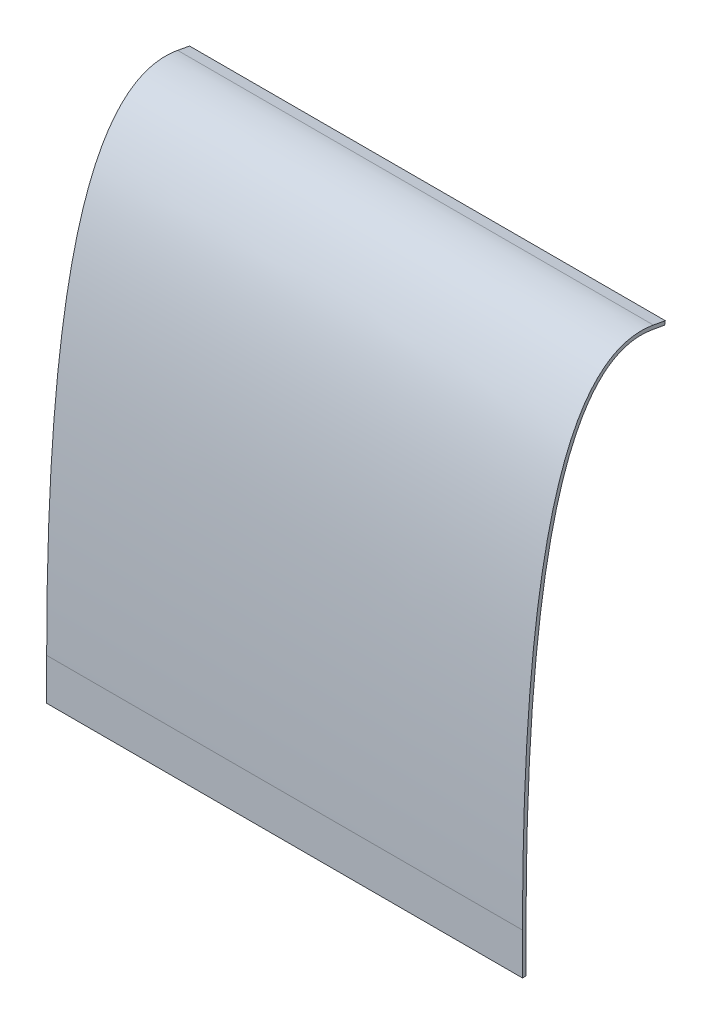
ISO-10303-21;
HEADER;
FILE_DESCRIPTION(('STEP AP214'),'2;1');
FILE_NAME('part.step','',(''),(''),'','','');
FILE_SCHEMA(('AUTOMOTIVE_DESIGN { 1 0 10303 214 1 1 1 1 }'));
ENDSEC;
DATA;
#1=APPLICATION_CONTEXT('core data for automotive mechanical design processes');
#2=APPLICATION_PROTOCOL_DEFINITION('international standard','automotive_design',2000,#1);
#3=PRODUCT_CONTEXT('',#1,'mechanical');
#4=PRODUCT('Part','Part','',(#3));
#5=PRODUCT_RELATED_PRODUCT_CATEGORY('part','',(#4));
#6=PRODUCT_DEFINITION_FORMATION('','',#4);
#7=PRODUCT_DEFINITION_CONTEXT('part definition',#1,'design');
#8=PRODUCT_DEFINITION('design','',#6,#7);
#9=PRODUCT_DEFINITION_SHAPE('','',#8);
#10=(LENGTH_UNIT() NAMED_UNIT(*) SI_UNIT(.MILLI.,.METRE.));
#11=(NAMED_UNIT(*) PLANE_ANGLE_UNIT() SI_UNIT($,.RADIAN.));
#12=(NAMED_UNIT(*) SI_UNIT($,.STERADIAN.) SOLID_ANGLE_UNIT());
#13=UNCERTAINTY_MEASURE_WITH_UNIT(LENGTH_MEASURE(1.E-05),#10,'distance_accuracy_value','');
#14=(GEOMETRIC_REPRESENTATION_CONTEXT(3) GLOBAL_UNCERTAINTY_ASSIGNED_CONTEXT((#13)) GLOBAL_UNIT_ASSIGNED_CONTEXT((#10,
#11,#12)) REPRESENTATION_CONTEXT('',''));
#15=CARTESIAN_POINT('',(0.,0.,0.));
#16=DIRECTION('',(0.,0.,1.));
#17=DIRECTION('',(1.,0.,0.));
#18=AXIS2_PLACEMENT_3D('',#15,#16,#17);
#19=CARTESIAN_POINT('',(0.,-5389.85380798461,3.175));
#20=DIRECTION('',(1.,0.,0.));
#21=DIRECTION('',(0.,0.,-1.));
#22=AXIS2_PLACEMENT_3D('',#19,#20,#21);
#23=PLANE('',#22);
#24=DIRECTION('',(0.,-1.,0.));
#25=VECTOR('',#24,1.);
#26=CARTESIAN_POINT('',(0.,-5389.85380798461,0.));
#27=LINE('',#26,#25);
#28=CARTESIAN_POINT('',(0.,-5353.3688870865,0.));
#29=VERTEX_POINT('',#28);
#30=CARTESIAN_POINT('',(0.,-5389.85380798461,0.));
#31=VERTEX_POINT('',#30);
#32=EDGE_CURVE('E95',#29,#31,#27,.T.);
#33=ORIENTED_EDGE('',*,*,#32,.T.);
#34=DIRECTION('',(0.,0.,-1.));
#35=VECTOR('',#34,1.);
#36=CARTESIAN_POINT('',(0.,-5389.85380798461,3.175));
#37=LINE('',#36,#35);
#38=CARTESIAN_POINT('',(0.,-5389.85380798461,3.175));
#39=VERTEX_POINT('',#38);
#40=EDGE_CURVE('E11',#39,#31,#37,.T.);
#41=ORIENTED_EDGE('',*,*,#40,.F.);
#42=DIRECTION('',(0.,-1.,0.));
#43=VECTOR('',#42,1.);
#44=CARTESIAN_POINT('',(0.,-5389.85380798461,3.175));
#45=LINE('',#44,#43);
#46=CARTESIAN_POINT('',(0.,-5353.3688870865,3.175));
#47=VERTEX_POINT('',#46);
#48=EDGE_CURVE('E88',#47,#39,#45,.T.);
#49=ORIENTED_EDGE('',*,*,#48,.F.);
#50=CARTESIAN_POINT('',(0.,-5353.36888708653,3.17500000000778));
#51=CARTESIAN_POINT('',(0.,-5351.18739690908,3.17500000000778));
#52=CARTESIAN_POINT('',(0.,-5346.81143134342,3.17046541119345));
#53=CARTESIAN_POINT('',(0.,-5338.16341017679,3.14325696182242));
#54=CARTESIAN_POINT('',(0.,-5327.47644189035,3.07523348434954));
#55=CARTESIAN_POINT('',(0.,-5314.87146346383,2.93917848605212));
#56=CARTESIAN_POINT('',(0.,-5298.34930967854,2.68519354129867));
#57=CARTESIAN_POINT('',(0.,-5278.23364403991,2.23160969948364));
#58=CARTESIAN_POINT('',(0.,-5254.95270820311,1.46947489333195));
#59=CARTESIAN_POINT('',(0.,-5232.52968924308,0.489420194706527));
#60=CARTESIAN_POINT('',(0.,-5203.7757149345,-1.10802295378445));
#61=CARTESIAN_POINT('',(0.,-5169.97633138787,-3.65020946172273));
#62=CARTESIAN_POINT('',(0.,-5132.84268915828,-7.57487259670182));
#63=CARTESIAN_POINT('',(0.,-5099.13022129233,-12.375948375276));
#64=CARTESIAN_POINT('',(0.,-5068.83293071087,-18.056948381596));
#65=CARTESIAN_POINT('',(0.,-5032.97936704028,-26.8143362972724));
#66=CARTESIAN_POINT('',(0.,-5003.91866903713,-37.3605308212154));
#67=CARTESIAN_POINT('',(0.,-4981.59890734606,-49.7957669766794));
#68=CARTESIAN_POINT('',(0.,-4968.22739997437,-60.1213480910538));
#69=CARTESIAN_POINT('',(0.,-4958.25876967498,-71.5130112879676));
#70=CARTESIAN_POINT('',(0.,-4952.88090222438,-81.9236706532397));
#71=CARTESIAN_POINT('',(0.,-4950.40661848939,-90.7533778061212));
#72=CARTESIAN_POINT('',(0.,-4949.47166616038,-97.5979563520359));
#73=CARTESIAN_POINT('',(0.,-4949.45950651735,-103.47459510175));
#74=CARTESIAN_POINT('',(0.,-4949.90159840565,-108.253920150395));
#75=CARTESIAN_POINT('',(0.,-4950.27722005877,-110.696774930827));
#76=CARTESIAN_POINT('',(0.,-4950.49814138065,-111.902729484396));
#77=B_SPLINE_CURVE_WITH_KNOTS('',3,(#50,#51,#52,#53,#54,#55,#56,#57,#58,#59,#60,#61,#62,#63,#64,
#65,#66,#67,#68,#69,#70,#71,#72,#73,#74,#75,#76),.UNSPECIFIED.,.F.,.F.,(4,1,1,1,1,1,1,1,1,1,1,1,
1,1,1,1,1,1,1,1,1,1,1,1,4),(0.490445446996945,0.490528714033794,0.490611981070642,
0.49077851514434,0.490945049218037,0.491111583291735,0.49144465143913,0.491777719586525,
0.49211078773392,0.492443855881316,0.493109992176106,0.493776128470896,0.494442264765686,
0.495108401060477,0.495774537355267,0.497106809944847,0.497772946239638,0.498439082534428,
0.499105218829218,0.499771355124008,0.500104423271403,0.500437491418799,0.500770559566194,
0.500937093639891,0.501103627713589),.UNSPECIFIED.);
#78=CARTESIAN_POINT('',(0.,-4950.49814138065,-111.902729484396));
#79=VERTEX_POINT('',#78);
#80=EDGE_CURVE('E49',#47,#79,#77,.T.);
#81=ORIENTED_EDGE('',*,*,#80,.T.);
#82=DIRECTION('',(0.,-0.180193443157536,-0.983631192593561));
#83=VECTOR('',#82,1.);
#84=CARTESIAN_POINT('',(0.,-4950.49814138065,-111.902729484396));
#85=LINE('',#84,#83);
#86=CARTESIAN_POINT('',(0.,-4952.41570760408,-122.370246604772));
#87=VERTEX_POINT('',#86);
#88=EDGE_CURVE('E143',#79,#87,#85,.T.);
#89=ORIENTED_EDGE('',*,*,#88,.T.);
#90=DIRECTION('',(0.,-0.983631192592152,0.180193443165231));
#91=VECTOR('',#90,1.);
#92=CARTESIAN_POINT('',(0.,-4955.53873664056,-121.798132422722));
#93=LINE('',#92,#91);
#94=CARTESIAN_POINT('',(0.,-4955.53873664056,-121.798132422722));
#95=VERTEX_POINT('',#94);
#96=EDGE_CURVE('E134',#87,#95,#93,.T.);
#97=ORIENTED_EDGE('',*,*,#96,.T.);
#98=DIRECTION('',(0.,0.180193443165247,0.983631192592149));
#99=VECTOR('',#98,1.);
#100=CARTESIAN_POINT('',(0.,-4953.62117041705,-111.330615302368));
#101=LINE('',#100,#99);
#102=CARTESIAN_POINT('',(0.,-4953.62117041705,-111.330615302368));
#103=VERTEX_POINT('',#102);
#104=EDGE_CURVE('E126',#95,#103,#101,.T.);
#105=ORIENTED_EDGE('',*,*,#104,.T.);
#106=CARTESIAN_POINT('',(0.,-972107.596731901,-254466.03500471));
#107=CARTESIAN_POINT('',(0.,964565.767885179,244923.154052706));
#108=CARTESIAN_POINT('',(0.,-976840.422920165,-235738.146311021));
#109=B_SPLINE_CURVE_WITH_KNOTS('',2,(#106,#107,#108),.UNSPECIFIED.,.F.,.F.,(3,3),(0.,1.),.UNSPECIFIED.);
#110=EDGE_CURVE('E70',#103,#29,#109,.T.);
#111=ORIENTED_EDGE('',*,*,#110,.T.);
#112=EDGE_LOOP('',(#33,#41,#49,#81,#89,#97,#105,#111));
#113=FACE_BOUND('',#112,.T.);
#114=ADVANCED_FACE('F33',(#113),#23,.F.);
#115=CARTESIAN_POINT('',(0.,-5389.85380798461,3.175));
#116=DIRECTION('',(0.,1.,0.));
#117=DIRECTION('',(0.,0.,1.));
#118=AXIS2_PLACEMENT_3D('',#115,#116,#117);
#119=PLANE('',#118);
#120=DIRECTION('',(1.,0.,0.));
#121=VECTOR('',#120,1.);
#122=CARTESIAN_POINT('',(0.,-5389.85380798461,0.));
#123=LINE('',#122,#121);
#124=CARTESIAN_POINT('',(418.07892,-5389.85380798461,0.));
#125=VERTEX_POINT('',#124);
#126=EDGE_CURVE('E62',#31,#125,#123,.T.);
#127=ORIENTED_EDGE('',*,*,#126,.T.);
#128=DIRECTION('',(0.,0.,-1.));
#129=VECTOR('',#128,1.);
#130=CARTESIAN_POINT('',(418.07892,-5389.85380798461,3.175));
#131=LINE('',#130,#129);
#132=CARTESIAN_POINT('',(418.07892,-5389.85380798461,3.175));
#133=VERTEX_POINT('',#132);
#134=EDGE_CURVE('E41',#133,#125,#131,.T.);
#135=ORIENTED_EDGE('',*,*,#134,.F.);
#136=DIRECTION('',(1.,0.,0.));
#137=VECTOR('',#136,1.);
#138=CARTESIAN_POINT('',(0.,-5389.85380798461,3.175));
#139=LINE('',#138,#137);
#140=EDGE_CURVE('E79',#39,#133,#139,.T.);
#141=ORIENTED_EDGE('',*,*,#140,.F.);
#142=ORIENTED_EDGE('',*,*,#40,.T.);
#143=EDGE_LOOP('',(#127,#135,#141,#142));
#144=FACE_BOUND('',#143,.T.);
#145=ADVANCED_FACE('F81',(#144),#119,.F.);
#146=CARTESIAN_POINT('',(418.07892,-5389.85380798461,3.175));
#147=DIRECTION('',(-1.,0.,0.));
#148=DIRECTION('',(0.,0.,1.));
#149=AXIS2_PLACEMENT_3D('',#146,#147,#148);
#150=PLANE('',#149);
#151=DIRECTION('',(0.,1.,0.));
#152=VECTOR('',#151,1.);
#153=CARTESIAN_POINT('',(418.07892,-5389.85380798461,0.));
#154=LINE('',#153,#152);
#155=CARTESIAN_POINT('',(418.07892,-5353.3688870865,0.));
#156=VERTEX_POINT('',#155);
#157=EDGE_CURVE('E98',#125,#156,#154,.T.);
#158=ORIENTED_EDGE('',*,*,#157,.T.);
#159=CARTESIAN_POINT('',(418.07892,-972107.596731901,-254466.03500471));
#160=CARTESIAN_POINT('',(418.07892,964565.767885179,244923.154052706));
#161=CARTESIAN_POINT('',(418.07892,-976840.422920165,-235738.146311021));
#162=B_SPLINE_CURVE_WITH_KNOTS('',2,(#159,#160,#161),.UNSPECIFIED.,.F.,.F.,(3,3),(0.,1.),.UNSPECIFIED.);
#163=CARTESIAN_POINT('',(418.07892,-4953.62117041705,-111.330615302368));
#164=VERTEX_POINT('',#163);
#165=EDGE_CURVE('E112',#164,#156,#162,.T.);
#166=ORIENTED_EDGE('',*,*,#165,.F.);
#167=DIRECTION('',(0.,0.180193443165247,0.983631192592149));
#168=VECTOR('',#167,1.);
#169=CARTESIAN_POINT('',(418.07892,-4953.62117041705,-111.330615302368));
#170=LINE('',#169,#168);
#171=CARTESIAN_POINT('',(418.07892,-4955.53873664056,-121.798132422722));
#172=VERTEX_POINT('',#171);
#173=EDGE_CURVE('E120',#172,#164,#170,.T.);
#174=ORIENTED_EDGE('',*,*,#173,.F.);
#175=DIRECTION('',(0.,-0.983631192592152,0.180193443165231));
#176=VECTOR('',#175,1.);
#177=CARTESIAN_POINT('',(418.07892,-4955.53873664056,-121.798132422722));
#178=LINE('',#177,#176);
#179=CARTESIAN_POINT('',(418.07892,-4952.41570760408,-122.370246604772));
#180=VERTEX_POINT('',#179);
#181=EDGE_CURVE('E131',#180,#172,#178,.T.);
#182=ORIENTED_EDGE('',*,*,#181,.F.);
#183=DIRECTION('',(0.,-0.180193443157536,-0.983631192593561));
#184=VECTOR('',#183,1.);
#185=CARTESIAN_POINT('',(418.07892,-4950.49814138065,-111.902729484396));
#186=LINE('',#185,#184);
#187=CARTESIAN_POINT('',(418.07892,-4950.49814138065,-111.902729484396));
#188=VERTEX_POINT('',#187);
#189=EDGE_CURVE('E140',#188,#180,#186,.T.);
#190=ORIENTED_EDGE('',*,*,#189,.F.);
#191=CARTESIAN_POINT('',(418.07892,-5353.36888708653,3.17500000000778));
#192=CARTESIAN_POINT('',(418.07892,-5351.18739690908,3.17500000000778));
#193=CARTESIAN_POINT('',(418.07892,-5346.81143134342,3.17046541119345));
#194=CARTESIAN_POINT('',(418.07892,-5338.16341017679,3.14325696182242));
#195=CARTESIAN_POINT('',(418.07892,-5327.47644189035,3.07523348434954));
#196=CARTESIAN_POINT('',(418.07892,-5314.87146346383,2.93917848605212));
#197=CARTESIAN_POINT('',(418.07892,-5298.34930967854,2.68519354129867));
#198=CARTESIAN_POINT('',(418.07892,-5278.23364403991,2.23160969948364));
#199=CARTESIAN_POINT('',(418.07892,-5254.95270820311,1.46947489333195));
#200=CARTESIAN_POINT('',(418.07892,-5232.52968924308,0.489420194706527));
#201=CARTESIAN_POINT('',(418.07892,-5203.7757149345,-1.10802295378445));
#202=CARTESIAN_POINT('',(418.07892,-5169.97633138787,-3.65020946172273));
#203=CARTESIAN_POINT('',(418.07892,-5132.84268915828,-7.57487259670182));
#204=CARTESIAN_POINT('',(418.07892,-5099.13022129233,-12.375948375276));
#205=CARTESIAN_POINT('',(418.07892,-5068.83293071087,-18.056948381596));
#206=CARTESIAN_POINT('',(418.07892,-5032.97936704028,-26.8143362972724));
#207=CARTESIAN_POINT('',(418.07892,-5003.91866903713,-37.3605308212154));
#208=CARTESIAN_POINT('',(418.07892,-4981.59890734606,-49.7957669766794));
#209=CARTESIAN_POINT('',(418.07892,-4968.22739997437,-60.1213480910538));
#210=CARTESIAN_POINT('',(418.07892,-4958.25876967498,-71.5130112879676));
#211=CARTESIAN_POINT('',(418.07892,-4952.88090222438,-81.9236706532397));
#212=CARTESIAN_POINT('',(418.07892,-4950.40661848939,-90.7533778061212));
#213=CARTESIAN_POINT('',(418.07892,-4949.47166616038,-97.5979563520359));
#214=CARTESIAN_POINT('',(418.07892,-4949.45950651735,-103.47459510175));
#215=CARTESIAN_POINT('',(418.07892,-4949.90159840565,-108.253920150395));
#216=CARTESIAN_POINT('',(418.07892,-4950.27722005877,-110.696774930827));
#217=CARTESIAN_POINT('',(418.07892,-4950.49814138065,-111.902729484396));
#218=B_SPLINE_CURVE_WITH_KNOTS('',3,(#191,#192,#193,#194,#195,#196,#197,#198,#199,#200,#201,
#202,#203,#204,#205,#206,#207,#208,#209,#210,#211,#212,#213,#214,#215,#216,#217),.UNSPECIFIED.,
.F.,.F.,(4,1,1,1,1,1,1,1,1,1,1,1,1,1,1,1,1,1,1,1,1,1,1,1,4),(0.490445446996945,
0.490528714033794,0.490611981070642,0.49077851514434,0.490945049218037,0.491111583291735,
0.49144465143913,0.491777719586525,0.49211078773392,0.492443855881316,0.493109992176106,
0.493776128470896,0.494442264765686,0.495108401060477,0.495774537355267,0.497106809944847,
0.497772946239638,0.498439082534428,0.499105218829218,0.499771355124008,0.500104423271403,
0.500437491418799,0.500770559566194,0.500937093639891,0.501103627713589),.UNSPECIFIED.);
#219=CARTESIAN_POINT('',(418.07892,-5353.36888708653,3.17500000000778));
#220=VERTEX_POINT('',#219);
#221=EDGE_CURVE('E149',#220,#188,#218,.T.);
#222=ORIENTED_EDGE('',*,*,#221,.F.);
#223=DIRECTION('',(0.,1.,0.));
#224=VECTOR('',#223,1.);
#225=CARTESIAN_POINT('',(418.07892,-5389.85380798461,3.175));
#226=LINE('',#225,#224);
#227=EDGE_CURVE('E87',#133,#220,#226,.T.);
#228=ORIENTED_EDGE('',*,*,#227,.F.);
#229=ORIENTED_EDGE('',*,*,#134,.T.);
#230=EDGE_LOOP('',(#158,#166,#174,#182,#190,#222,#228,#229));
#231=FACE_BOUND('',#230,.T.);
#232=ADVANCED_FACE('F196',(#231),#150,.F.);
#233=CARTESIAN_POINT('',(0.,0.,3.175));
#234=DIRECTION('',(0.,0.,-1.));
#235=DIRECTION('',(-1.,0.,0.));
#236=AXIS2_PLACEMENT_3D('',#233,#234,#235);
#237=PLANE('',#236);
#238=ORIENTED_EDGE('',*,*,#48,.T.);
#239=ORIENTED_EDGE('',*,*,#140,.T.);
#240=ORIENTED_EDGE('',*,*,#227,.T.);
#241=DIRECTION('',(-1.,0.,0.));
#242=VECTOR('',#241,1.);
#243=CARTESIAN_POINT('',(0.,-5353.3688870865,3.175));
#244=LINE('',#243,#242);
#245=EDGE_CURVE('E92',#220,#47,#244,.T.);
#246=ORIENTED_EDGE('',*,*,#245,.T.);
#247=EDGE_LOOP('',(#238,#239,#240,#246));
#248=FACE_BOUND('',#247,.T.);
#249=ADVANCED_FACE('F91',(#248),#237,.F.);
#250=CARTESIAN_POINT('',(0.,0.,0.));
#251=DIRECTION('',(0.,0.,-1.));
#252=DIRECTION('',(-1.,0.,0.));
#253=AXIS2_PLACEMENT_3D('',#250,#251,#252);
#254=PLANE('',#253);
#255=ORIENTED_EDGE('',*,*,#32,.F.);
#256=DIRECTION('',(-1.,0.,0.));
#257=VECTOR('',#256,1.);
#258=CARTESIAN_POINT('',(0.,-5353.3688870865,0.));
#259=LINE('',#258,#257);
#260=EDGE_CURVE('E93',#156,#29,#259,.T.);
#261=ORIENTED_EDGE('',*,*,#260,.F.);
#262=ORIENTED_EDGE('',*,*,#157,.F.);
#263=ORIENTED_EDGE('',*,*,#126,.F.);
#264=EDGE_LOOP('',(#255,#261,#262,#263));
#265=FACE_BOUND('',#264,.T.);
#266=ADVANCED_FACE('F203',(#265),#254,.T.);
#267=CARTESIAN_POINT('',(418.07892,-5353.36888708653,3.17500000000778));
#268=CARTESIAN_POINT('',(0.,-5353.36888708653,3.17500000000778));
#269=CARTESIAN_POINT('',(418.07892,-5351.18739690908,3.17500000000778));
#270=CARTESIAN_POINT('',(0.,-5351.18739690908,3.17500000000778));
#271=CARTESIAN_POINT('',(418.07892,-5346.81143134342,3.17046541119345));
#272=CARTESIAN_POINT('',(0.,-5346.81143134342,3.17046541119345));
#273=CARTESIAN_POINT('',(418.07892,-5338.16341017679,3.14325696182242));
#274=CARTESIAN_POINT('',(0.,-5338.16341017679,3.14325696182242));
#275=CARTESIAN_POINT('',(418.07892,-5327.47644189035,3.07523348434954));
#276=CARTESIAN_POINT('',(0.,-5327.47644189035,3.07523348434954));
#277=CARTESIAN_POINT('',(418.07892,-5314.87146346383,2.93917848605212));
#278=CARTESIAN_POINT('',(0.,-5314.87146346383,2.93917848605212));
#279=CARTESIAN_POINT('',(418.07892,-5298.34930967854,2.68519354129867));
#280=CARTESIAN_POINT('',(0.,-5298.34930967854,2.68519354129867));
#281=CARTESIAN_POINT('',(418.07892,-5278.23364403991,2.23160969948364));
#282=CARTESIAN_POINT('',(0.,-5278.23364403991,2.23160969948364));
#283=CARTESIAN_POINT('',(418.07892,-5254.95270820311,1.46947489333195));
#284=CARTESIAN_POINT('',(0.,-5254.95270820311,1.46947489333195));
#285=CARTESIAN_POINT('',(418.07892,-5232.52968924308,0.489420194706527));
#286=CARTESIAN_POINT('',(0.,-5232.52968924308,0.489420194706527));
#287=CARTESIAN_POINT('',(418.07892,-5203.7757149345,-1.10802295378445));
#288=CARTESIAN_POINT('',(0.,-5203.7757149345,-1.10802295378445));
#289=CARTESIAN_POINT('',(418.07892,-5169.97633138787,-3.65020946172273));
#290=CARTESIAN_POINT('',(0.,-5169.97633138787,-3.65020946172273));
#291=CARTESIAN_POINT('',(418.07892,-5132.84268915828,-7.57487259670182));
#292=CARTESIAN_POINT('',(0.,-5132.84268915828,-7.57487259670182));
#293=CARTESIAN_POINT('',(418.07892,-5099.13022129233,-12.375948375276));
#294=CARTESIAN_POINT('',(0.,-5099.13022129233,-12.375948375276));
#295=CARTESIAN_POINT('',(418.07892,-5068.83293071087,-18.056948381596));
#296=CARTESIAN_POINT('',(0.,-5068.83293071087,-18.056948381596));
#297=CARTESIAN_POINT('',(418.07892,-5032.97936704028,-26.8143362972724));
#298=CARTESIAN_POINT('',(0.,-5032.97936704028,-26.8143362972724));
#299=CARTESIAN_POINT('',(418.07892,-5003.91866903713,-37.3605308212154));
#300=CARTESIAN_POINT('',(0.,-5003.91866903713,-37.3605308212154));
#301=CARTESIAN_POINT('',(418.07892,-4981.59890734606,-49.7957669766794));
#302=CARTESIAN_POINT('',(0.,-4981.59890734606,-49.7957669766794));
#303=CARTESIAN_POINT('',(418.07892,-4968.22739997437,-60.1213480910538));
#304=CARTESIAN_POINT('',(0.,-4968.22739997437,-60.1213480910538));
#305=CARTESIAN_POINT('',(418.07892,-4958.25876967498,-71.5130112879676));
#306=CARTESIAN_POINT('',(0.,-4958.25876967498,-71.5130112879676));
#307=CARTESIAN_POINT('',(418.07892,-4952.88090222438,-81.9236706532397));
#308=CARTESIAN_POINT('',(0.,-4952.88090222438,-81.9236706532397));
#309=CARTESIAN_POINT('',(418.07892,-4950.40661848939,-90.7533778061212));
#310=CARTESIAN_POINT('',(0.,-4950.40661848939,-90.7533778061212));
#311=CARTESIAN_POINT('',(418.07892,-4949.47166616038,-97.5979563520359));
#312=CARTESIAN_POINT('',(0.,-4949.47166616038,-97.5979563520359));
#313=CARTESIAN_POINT('',(418.07892,-4949.45950651735,-103.47459510175));
#314=CARTESIAN_POINT('',(0.,-4949.45950651735,-103.47459510175));
#315=CARTESIAN_POINT('',(418.07892,-4949.90159840565,-108.253920150395));
#316=CARTESIAN_POINT('',(0.,-4949.90159840565,-108.253920150395));
#317=CARTESIAN_POINT('',(418.07892,-4950.27722005877,-110.696774930827));
#318=CARTESIAN_POINT('',(0.,-4950.27722005877,-110.696774930827));
#319=CARTESIAN_POINT('',(418.07892,-4950.49814138065,-111.902729484396));
#320=CARTESIAN_POINT('',(0.,-4950.49814138065,-111.902729484396));
#321=B_SPLINE_SURFACE_WITH_KNOTS('',3,1,((#267,#268),(#269,#270),(#271,#272),(#273,#274),(#275,
#276),(#277,#278),(#279,#280),(#281,#282),(#283,#284),(#285,#286),(#287,#288),(#289,#290),(#291,
#292),(#293,#294),(#295,#296),(#297,#298),(#299,#300),(#301,#302),(#303,#304),(#305,#306),(#307,
#308),(#309,#310),(#311,#312),(#313,#314),(#315,#316),(#317,#318),(#319,#320)),.UNSPECIFIED.,
.F.,.F.,.F.,(4,1,1,1,1,1,1,1,1,1,1,1,1,1,1,1,1,1,1,1,1,1,1,1,4),(2,2),(0.,0.00781250000000179,
0.0156249999999984,0.0312499999999967,0.0468750000000003,0.0624999999999987,0.0937500000000007,
0.124999999999997,0.156249999999999,0.187500000000001,0.25,0.312499999999999,0.375000000000003,
0.437500000000001,0.5,0.624999999999997,0.687500000000001,0.75,0.812499999999999,
0.875000000000003,0.906249999999999,0.937500000000007,0.968750000000003,0.984374999999996,1.),
(0.,1.),.UNSPECIFIED.);
#322=DIRECTION('',(-1.,0.,0.));
#323=VECTOR('',#322,1.);
#324=CARTESIAN_POINT('',(418.07892,-4950.49814138065,-111.902729484396));
#325=LINE('',#324,#323);
#326=EDGE_CURVE('E146',#188,#79,#325,.T.);
#327=ORIENTED_EDGE('',*,*,#326,.T.);
#328=ORIENTED_EDGE('',*,*,#80,.F.);
#329=ORIENTED_EDGE('',*,*,#245,.F.);
#330=ORIENTED_EDGE('',*,*,#221,.T.);
#331=EDGE_LOOP('',(#327,#328,#329,#330));
#332=FACE_BOUND('',#331,.T.);
#333=ADVANCED_FACE('F166',(#332),#321,.T.);
#334=CARTESIAN_POINT('',(418.07892,-4950.49814138065,-111.902729484396));
#335=DIRECTION('',(0.,0.983631192593561,-0.180193443157536));
#336=DIRECTION('',(0.,0.180193443157536,0.983631192593561));
#337=AXIS2_PLACEMENT_3D('',#334,#335,#336);
#338=PLANE('',#337);
#339=DIRECTION('',(-1.,0.,0.));
#340=VECTOR('',#339,1.);
#341=CARTESIAN_POINT('',(418.07892,-4952.41570760408,-122.370246604772));
#342=LINE('',#341,#340);
#343=EDGE_CURVE('E137',#180,#87,#342,.T.);
#344=ORIENTED_EDGE('',*,*,#343,.T.);
#345=ORIENTED_EDGE('',*,*,#88,.F.);
#346=ORIENTED_EDGE('',*,*,#326,.F.);
#347=ORIENTED_EDGE('',*,*,#189,.T.);
#348=EDGE_LOOP('',(#344,#345,#346,#347));
#349=FACE_BOUND('',#348,.T.);
#350=ADVANCED_FACE('F173',(#349),#338,.T.);
#351=CARTESIAN_POINT('',(418.07892,-4955.53873664056,-121.798132422722));
#352=DIRECTION('',(0.,-0.180193443165231,-0.983631192592152));
#353=DIRECTION('',(0.,0.983631192592152,-0.180193443165231));
#354=AXIS2_PLACEMENT_3D('',#351,#352,#353);
#355=PLANE('',#354);
#356=DIRECTION('',(-1.,0.,0.));
#357=VECTOR('',#356,1.);
#358=CARTESIAN_POINT('',(418.07892,-4955.53873664056,-121.798132422722));
#359=LINE('',#358,#357);
#360=EDGE_CURVE('E128',#172,#95,#359,.T.);
#361=ORIENTED_EDGE('',*,*,#360,.T.);
#362=ORIENTED_EDGE('',*,*,#96,.F.);
#363=ORIENTED_EDGE('',*,*,#343,.F.);
#364=ORIENTED_EDGE('',*,*,#181,.T.);
#365=EDGE_LOOP('',(#361,#362,#363,#364));
#366=FACE_BOUND('',#365,.T.);
#367=ADVANCED_FACE('F181',(#366),#355,.T.);
#368=CARTESIAN_POINT('',(418.07892,-4953.62117041705,-111.330615302368));
#369=DIRECTION('',(0.,-0.983631192592149,0.180193443165247));
#370=DIRECTION('',(0.,-0.180193443165247,-0.983631192592149));
#371=AXIS2_PLACEMENT_3D('',#368,#369,#370);
#372=PLANE('',#371);
#373=DIRECTION('',(-1.,0.,0.));
#374=VECTOR('',#373,1.);
#375=CARTESIAN_POINT('',(418.07892,-4953.62117041705,-111.330615302368));
#376=LINE('',#375,#374);
#377=EDGE_CURVE('E100',#164,#103,#376,.T.);
#378=ORIENTED_EDGE('',*,*,#377,.T.);
#379=ORIENTED_EDGE('',*,*,#104,.F.);
#380=ORIENTED_EDGE('',*,*,#360,.F.);
#381=ORIENTED_EDGE('',*,*,#173,.T.);
#382=EDGE_LOOP('',(#378,#379,#380,#381));
#383=FACE_BOUND('',#382,.T.);
#384=ADVANCED_FACE('F187',(#383),#372,.T.);
#385=CARTESIAN_POINT('',(418.07892,-4953.62117041713,-111.330615302346));
#386=CARTESIAN_POINT('',(0.,-4953.62117041713,-111.330615302346));
#387=CARTESIAN_POINT('',(418.07892,-4933.22628354072,5.06539254985228E-12));
#388=CARTESIAN_POINT('',(0.,-4933.22628354072,5.06539254985228E-12));
#389=CARTESIAN_POINT('',(418.07892,-5353.36888708648,1.53099417266305E-11));
#390=CARTESIAN_POINT('',(0.,-5353.36888708648,1.53099417266305E-11));
#391=B_SPLINE_SURFACE_WITH_KNOTS('',2,1,((#385,#386),(#387,#388),(#389,#390)),.UNSPECIFIED.,.F.,
.F.,.F.,(3,3),(2,2),(0.,1.),(0.,1.),.UNSPECIFIED.);
#392=ORIENTED_EDGE('',*,*,#260,.T.);
#393=ORIENTED_EDGE('',*,*,#110,.F.);
#394=ORIENTED_EDGE('',*,*,#377,.F.);
#395=ORIENTED_EDGE('',*,*,#165,.T.);
#396=EDGE_LOOP('',(#392,#393,#394,#395));
#397=FACE_BOUND('',#396,.T.);
#398=ADVANCED_FACE('F237',(#397),#391,.T.);
#399=CLOSED_SHELL('',(#114,#145,#232,#249,#266,#333,#350,#367,#384,#398));
#400=MANIFOLD_SOLID_BREP('B2',#399);
#401=ADVANCED_BREP_SHAPE_REPRESENTATION('',(#18,#400),#14);
#402=SHAPE_DEFINITION_REPRESENTATION(#9,#401);
ENDSEC;
END-ISO-10303-21;
